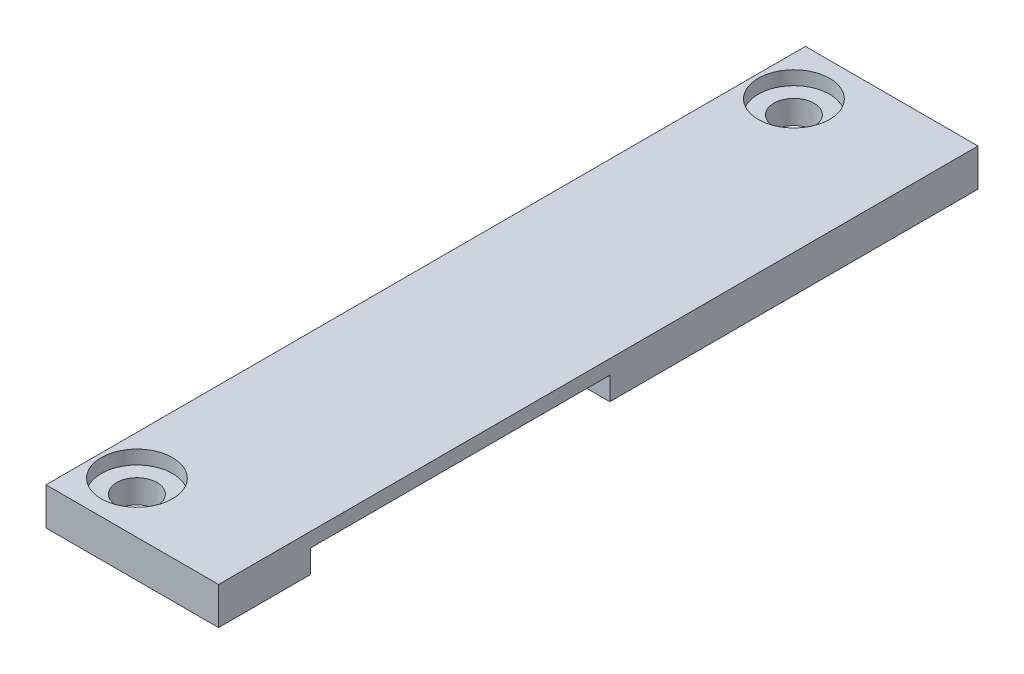
ISO-10303-21;
HEADER;
FILE_DESCRIPTION(('STEP AP214'),'2;1');
FILE_NAME('part.step','',(''),(''),'','','');
FILE_SCHEMA(('AUTOMOTIVE_DESIGN { 1 0 10303 214 1 1 1 1 }'));
ENDSEC;
DATA;
#1=APPLICATION_CONTEXT('core data for automotive mechanical design processes');
#2=APPLICATION_PROTOCOL_DEFINITION('international standard','automotive_design',2000,#1);
#3=PRODUCT_CONTEXT('',#1,'mechanical');
#4=PRODUCT('Part','Part','',(#3));
#5=PRODUCT_RELATED_PRODUCT_CATEGORY('part','',(#4));
#6=PRODUCT_DEFINITION_FORMATION('','',#4);
#7=PRODUCT_DEFINITION_CONTEXT('part definition',#1,'design');
#8=PRODUCT_DEFINITION('design','',#6,#7);
#9=PRODUCT_DEFINITION_SHAPE('','',#8);
#10=(LENGTH_UNIT() NAMED_UNIT(*) SI_UNIT(.MILLI.,.METRE.));
#11=(NAMED_UNIT(*) PLANE_ANGLE_UNIT() SI_UNIT($,.RADIAN.));
#12=(NAMED_UNIT(*) SI_UNIT($,.STERADIAN.) SOLID_ANGLE_UNIT());
#13=UNCERTAINTY_MEASURE_WITH_UNIT(LENGTH_MEASURE(1.E-05),#10,'distance_accuracy_value','');
#14=(GEOMETRIC_REPRESENTATION_CONTEXT(3) GLOBAL_UNCERTAINTY_ASSIGNED_CONTEXT((#13)) GLOBAL_UNIT_ASSIGNED_CONTEXT((#10,
#11,#12)) REPRESENTATION_CONTEXT('',''));
#15=CARTESIAN_POINT('',(0.,0.,0.));
#16=DIRECTION('',(0.,0.,1.));
#17=DIRECTION('',(1.,0.,0.));
#18=AXIS2_PLACEMENT_3D('',#15,#16,#17);
#19=CARTESIAN_POINT('',(3.45112221909818,-1.625,28.55));
#20=DIRECTION('',(0.,1.,0.));
#21=DIRECTION('',(0.,0.,1.));
#22=AXIS2_PLACEMENT_3D('',#19,#20,#21);
#23=CYLINDRICAL_SURFACE('',#22,1.75);
#24=CARTESIAN_POINT('',(3.45112221909818,-1.625,28.55));
#25=DIRECTION('',(0.,1.,0.));
#26=DIRECTION('',(0.,0.,1.));
#27=AXIS2_PLACEMENT_3D('',#24,#25,#26);
#28=CIRCLE('',#27,1.75);
#29=CARTESIAN_POINT('',(3.45112221909818,-1.625,30.3));
#30=VERTEX_POINT('',#29);
#31=EDGE_CURVE('E154',#30,#30,#28,.T.);
#32=ORIENTED_EDGE('',*,*,#31,.F.);
#33=EDGE_LOOP('',(#32));
#34=FACE_BOUND('',#33,.T.);
#35=CARTESIAN_POINT('',(3.45112221909818,0.425,28.55));
#36=DIRECTION('',(0.,1.,0.));
#37=DIRECTION('',(0.,0.,1.));
#38=AXIS2_PLACEMENT_3D('',#35,#36,#37);
#39=CIRCLE('',#38,1.75);
#40=CARTESIAN_POINT('',(3.45112221909818,0.425,30.3));
#41=VERTEX_POINT('',#40);
#42=EDGE_CURVE('E229',#41,#41,#39,.T.);
#43=ORIENTED_EDGE('',*,*,#42,.T.);
#44=EDGE_LOOP('',(#43));
#45=FACE_BOUND('',#44,.T.);
#46=ADVANCED_FACE('F47',(#34,#45),#23,.F.);
#47=CARTESIAN_POINT('',(3.45112221909818,-1.625,-28.55));
#48=DIRECTION('',(0.,1.,0.));
#49=DIRECTION('',(0.,0.,1.));
#50=AXIS2_PLACEMENT_3D('',#47,#48,#49);
#51=CYLINDRICAL_SURFACE('',#50,1.75);
#52=CARTESIAN_POINT('',(3.45112221909818,-1.625,-28.55));
#53=DIRECTION('',(0.,1.,0.));
#54=DIRECTION('',(0.,0.,1.));
#55=AXIS2_PLACEMENT_3D('',#52,#53,#54);
#56=CIRCLE('',#55,1.75);
#57=CARTESIAN_POINT('',(3.45112221909818,-1.625,-26.8));
#58=VERTEX_POINT('',#57);
#59=EDGE_CURVE('E212',#58,#58,#56,.T.);
#60=ORIENTED_EDGE('',*,*,#59,.F.);
#61=EDGE_LOOP('',(#60));
#62=FACE_BOUND('',#61,.T.);
#63=CARTESIAN_POINT('',(3.45112221909818,0.425,-28.55));
#64=DIRECTION('',(0.,1.,0.));
#65=DIRECTION('',(0.,0.,1.));
#66=AXIS2_PLACEMENT_3D('',#63,#64,#65);
#67=CIRCLE('',#66,1.75);
#68=CARTESIAN_POINT('',(3.45112221909818,0.425,-26.8));
#69=VERTEX_POINT('',#68);
#70=EDGE_CURVE('E225',#69,#69,#67,.T.);
#71=ORIENTED_EDGE('',*,*,#70,.T.);
#72=EDGE_LOOP('',(#71));
#73=FACE_BOUND('',#72,.T.);
#74=ADVANCED_FACE('F278',(#62,#73),#51,.F.);
#75=CARTESIAN_POINT('',(15.,0.,-1.));
#76=DIRECTION('',(0.,0.,1.));
#77=DIRECTION('',(1.,0.,0.));
#78=AXIS2_PLACEMENT_3D('',#75,#76,#77);
#79=PLANE('',#78);
#80=DIRECTION('',(0.,1.,0.));
#81=VECTOR('',#80,1.);
#82=CARTESIAN_POINT('',(0.,0.,-1.));
#83=LINE('',#82,#81);
#84=CARTESIAN_POINT('',(0.,-1.625,-1.));
#85=VERTEX_POINT('',#84);
#86=CARTESIAN_POINT('',(0.,0.375,-1.));
#87=VERTEX_POINT('',#86);
#88=EDGE_CURVE('E149',#85,#87,#83,.T.);
#89=ORIENTED_EDGE('',*,*,#88,.F.);
#90=DIRECTION('',(-1.,0.,0.));
#91=VECTOR('',#90,1.);
#92=CARTESIAN_POINT('',(15.,-1.625,-1.));
#93=LINE('',#92,#91);
#94=CARTESIAN_POINT('',(15.,-1.625,-1.));
#95=VERTEX_POINT('',#94);
#96=EDGE_CURVE('E11',#95,#85,#93,.T.);
#97=ORIENTED_EDGE('',*,*,#96,.F.);
#98=DIRECTION('',(0.,1.,0.));
#99=VECTOR('',#98,1.);
#100=CARTESIAN_POINT('',(15.,0.,-1.));
#101=LINE('',#100,#99);
#102=CARTESIAN_POINT('',(15.,0.375,-1.));
#103=VERTEX_POINT('',#102);
#104=EDGE_CURVE('E174',#95,#103,#101,.T.);
#105=ORIENTED_EDGE('',*,*,#104,.T.);
#106=DIRECTION('',(-1.,0.,0.));
#107=VECTOR('',#106,1.);
#108=CARTESIAN_POINT('',(15.,0.375,-1.));
#109=LINE('',#108,#107);
#110=EDGE_CURVE('E100',#103,#87,#109,.T.);
#111=ORIENTED_EDGE('',*,*,#110,.T.);
#112=EDGE_LOOP('',(#89,#97,#105,#111));
#113=FACE_BOUND('',#112,.T.);
#114=ADVANCED_FACE('F49',(#113),#79,.T.);
#115=CARTESIAN_POINT('',(15.,-1.625,0.));
#116=DIRECTION('',(0.,1.,0.));
#117=DIRECTION('',(0.,0.,1.));
#118=AXIS2_PLACEMENT_3D('',#115,#116,#117);
#119=PLANE('',#118);
#120=ORIENTED_EDGE('',*,*,#59,.T.);
#121=EDGE_LOOP('',(#120));
#122=FACE_BOUND('',#121,.T.);
#123=DIRECTION('',(0.,0.,-1.));
#124=VECTOR('',#123,1.);
#125=CARTESIAN_POINT('',(0.,-1.625,0.));
#126=LINE('',#125,#124);
#127=CARTESIAN_POINT('',(0.,-1.625,-33.));
#128=VERTEX_POINT('',#127);
#129=EDGE_CURVE('E153',#85,#128,#126,.T.);
#130=ORIENTED_EDGE('',*,*,#129,.T.);
#131=DIRECTION('',(-1.,0.,0.));
#132=VECTOR('',#131,1.);
#133=CARTESIAN_POINT('',(15.,-1.625,-33.));
#134=LINE('',#133,#132);
#135=CARTESIAN_POINT('',(15.,-1.625,-33.));
#136=VERTEX_POINT('',#135);
#137=EDGE_CURVE('E57',#136,#128,#134,.T.);
#138=ORIENTED_EDGE('',*,*,#137,.F.);
#139=DIRECTION('',(0.,0.,-1.));
#140=VECTOR('',#139,1.);
#141=CARTESIAN_POINT('',(15.,-1.625,0.));
#142=LINE('',#141,#140);
#143=EDGE_CURVE('E132',#95,#136,#142,.T.);
#144=ORIENTED_EDGE('',*,*,#143,.F.);
#145=ORIENTED_EDGE('',*,*,#96,.T.);
#146=EDGE_LOOP('',(#130,#138,#144,#145));
#147=FACE_BOUND('',#146,.T.);
#148=ADVANCED_FACE('F196',(#122,#147),#119,.F.);
#149=CARTESIAN_POINT('',(15.,0.,-33.));
#150=DIRECTION('',(0.,0.,-1.));
#151=DIRECTION('',(-1.,0.,0.));
#152=AXIS2_PLACEMENT_3D('',#149,#150,#151);
#153=PLANE('',#152);
#154=DIRECTION('',(0.,-1.,0.));
#155=VECTOR('',#154,1.);
#156=CARTESIAN_POINT('',(0.,0.,-33.));
#157=LINE('',#156,#155);
#158=CARTESIAN_POINT('',(0.,1.625,-33.));
#159=VERTEX_POINT('',#158);
#160=EDGE_CURVE('E158',#159,#128,#157,.T.);
#161=ORIENTED_EDGE('',*,*,#160,.F.);
#162=DIRECTION('',(-1.,0.,0.));
#163=VECTOR('',#162,1.);
#164=CARTESIAN_POINT('',(15.,1.625,-33.));
#165=LINE('',#164,#163);
#166=CARTESIAN_POINT('',(15.,1.625,-33.));
#167=VERTEX_POINT('',#166);
#168=EDGE_CURVE('E184',#167,#159,#165,.T.);
#169=ORIENTED_EDGE('',*,*,#168,.F.);
#170=DIRECTION('',(0.,-1.,0.));
#171=VECTOR('',#170,1.);
#172=CARTESIAN_POINT('',(15.,0.,-33.));
#173=LINE('',#172,#171);
#174=EDGE_CURVE('E193',#167,#136,#173,.T.);
#175=ORIENTED_EDGE('',*,*,#174,.T.);
#176=ORIENTED_EDGE('',*,*,#137,.T.);
#177=EDGE_LOOP('',(#161,#169,#175,#176));
#178=FACE_BOUND('',#177,.T.);
#179=ADVANCED_FACE('F191',(#178),#153,.T.);
#180=CARTESIAN_POINT('',(15.,1.625,0.));
#181=DIRECTION('',(0.,1.,0.));
#182=DIRECTION('',(0.,0.,1.));
#183=AXIS2_PLACEMENT_3D('',#180,#181,#182);
#184=PLANE('',#183);
#185=CARTESIAN_POINT('',(3.45112221909818,1.625,28.55));
#186=DIRECTION('',(0.,1.,0.));
#187=DIRECTION('',(0.,0.,1.));
#188=AXIS2_PLACEMENT_3D('',#185,#186,#187);
#189=CIRCLE('',#188,3.1);
#190=CARTESIAN_POINT('',(3.45112221909818,1.625,31.65));
#191=VERTEX_POINT('',#190);
#192=EDGE_CURVE('E233',#191,#191,#189,.T.);
#193=ORIENTED_EDGE('',*,*,#192,.F.);
#194=EDGE_LOOP('',(#193));
#195=FACE_BOUND('',#194,.T.);
#196=CARTESIAN_POINT('',(3.45112221909818,1.625,-28.55));
#197=DIRECTION('',(0.,1.,0.));
#198=DIRECTION('',(0.,0.,1.));
#199=AXIS2_PLACEMENT_3D('',#196,#197,#198);
#200=CIRCLE('',#199,3.1);
#201=CARTESIAN_POINT('',(3.45112221909818,1.625,-25.45));
#202=VERTEX_POINT('',#201);
#203=EDGE_CURVE('E220',#202,#202,#200,.T.);
#204=ORIENTED_EDGE('',*,*,#203,.F.);
#205=EDGE_LOOP('',(#204));
#206=FACE_BOUND('',#205,.T.);
#207=DIRECTION('',(0.,0.,-1.));
#208=VECTOR('',#207,1.);
#209=CARTESIAN_POINT('',(0.,1.625,0.));
#210=LINE('',#209,#208);
#211=CARTESIAN_POINT('',(0.,1.625,33.));
#212=VERTEX_POINT('',#211);
#213=EDGE_CURVE('E162',#212,#159,#210,.T.);
#214=ORIENTED_EDGE('',*,*,#213,.F.);
#215=DIRECTION('',(-1.,0.,0.));
#216=VECTOR('',#215,1.);
#217=CARTESIAN_POINT('',(15.,1.625,33.));
#218=LINE('',#217,#216);
#219=CARTESIAN_POINT('',(15.,1.625,33.));
#220=VERTEX_POINT('',#219);
#221=EDGE_CURVE('E181',#220,#212,#218,.T.);
#222=ORIENTED_EDGE('',*,*,#221,.F.);
#223=DIRECTION('',(0.,0.,-1.));
#224=VECTOR('',#223,1.);
#225=CARTESIAN_POINT('',(15.,1.625,0.));
#226=LINE('',#225,#224);
#227=EDGE_CURVE('E204',#220,#167,#226,.T.);
#228=ORIENTED_EDGE('',*,*,#227,.T.);
#229=ORIENTED_EDGE('',*,*,#168,.T.);
#230=EDGE_LOOP('',(#214,#222,#228,#229));
#231=FACE_BOUND('',#230,.T.);
#232=ADVANCED_FACE('F202',(#195,#206,#231),#184,.T.);
#233=CARTESIAN_POINT('',(15.,0.,33.));
#234=DIRECTION('',(0.,0.,-1.));
#235=DIRECTION('',(-1.,0.,0.));
#236=AXIS2_PLACEMENT_3D('',#233,#234,#235);
#237=PLANE('',#236);
#238=DIRECTION('',(0.,-1.,0.));
#239=VECTOR('',#238,1.);
#240=CARTESIAN_POINT('',(0.,0.,33.));
#241=LINE('',#240,#239);
#242=CARTESIAN_POINT('',(0.,-1.625,33.));
#243=VERTEX_POINT('',#242);
#244=EDGE_CURVE('E166',#212,#243,#241,.T.);
#245=ORIENTED_EDGE('',*,*,#244,.T.);
#246=DIRECTION('',(-1.,0.,0.));
#247=VECTOR('',#246,1.);
#248=CARTESIAN_POINT('',(15.,-1.625,33.));
#249=LINE('',#248,#247);
#250=CARTESIAN_POINT('',(15.,-1.625,33.));
#251=VERTEX_POINT('',#250);
#252=EDGE_CURVE('E138',#251,#243,#249,.T.);
#253=ORIENTED_EDGE('',*,*,#252,.F.);
#254=DIRECTION('',(0.,-1.,0.));
#255=VECTOR('',#254,1.);
#256=CARTESIAN_POINT('',(15.,0.,33.));
#257=LINE('',#256,#255);
#258=EDGE_CURVE('E126',#220,#251,#257,.T.);
#259=ORIENTED_EDGE('',*,*,#258,.F.);
#260=ORIENTED_EDGE('',*,*,#221,.T.);
#261=EDGE_LOOP('',(#245,#253,#259,#260));
#262=FACE_BOUND('',#261,.T.);
#263=ADVANCED_FACE('F260',(#262),#237,.F.);
#264=ORIENTED_EDGE('',*,*,#31,.T.);
#265=EDGE_LOOP('',(#264));
#266=FACE_BOUND('',#265,.T.);
#267=CARTESIAN_POINT('',(0.,-1.625,25.));
#268=VERTEX_POINT('',#267);
#269=EDGE_CURVE('E136',#243,#268,#126,.T.);
#270=ORIENTED_EDGE('',*,*,#269,.T.);
#271=DIRECTION('',(-1.,0.,0.));
#272=VECTOR('',#271,1.);
#273=CARTESIAN_POINT('',(15.,-1.625,25.));
#274=LINE('',#273,#272);
#275=CARTESIAN_POINT('',(15.,-1.625,25.));
#276=VERTEX_POINT('',#275);
#277=EDGE_CURVE('E133',#276,#268,#274,.T.);
#278=ORIENTED_EDGE('',*,*,#277,.F.);
#279=EDGE_CURVE('E119',#251,#276,#142,.T.);
#280=ORIENTED_EDGE('',*,*,#279,.F.);
#281=ORIENTED_EDGE('',*,*,#252,.T.);
#282=EDGE_LOOP('',(#270,#278,#280,#281));
#283=FACE_BOUND('',#282,.T.);
#284=ADVANCED_FACE('F134',(#266,#283),#119,.F.);
#285=CARTESIAN_POINT('',(15.,0.,25.));
#286=DIRECTION('',(0.,0.,1.));
#287=DIRECTION('',(1.,0.,0.));
#288=AXIS2_PLACEMENT_3D('',#285,#286,#287);
#289=PLANE('',#288);
#290=DIRECTION('',(0.,1.,0.));
#291=VECTOR('',#290,1.);
#292=CARTESIAN_POINT('',(0.,0.,25.));
#293=LINE('',#292,#291);
#294=CARTESIAN_POINT('',(0.,0.375,25.));
#295=VERTEX_POINT('',#294);
#296=EDGE_CURVE('E93',#268,#295,#293,.T.);
#297=ORIENTED_EDGE('',*,*,#296,.T.);
#298=DIRECTION('',(-1.,0.,0.));
#299=VECTOR('',#298,1.);
#300=CARTESIAN_POINT('',(15.,0.375,25.));
#301=LINE('',#300,#299);
#302=CARTESIAN_POINT('',(15.,0.375,25.));
#303=VERTEX_POINT('',#302);
#304=EDGE_CURVE('E139',#303,#295,#301,.T.);
#305=ORIENTED_EDGE('',*,*,#304,.F.);
#306=DIRECTION('',(0.,1.,0.));
#307=VECTOR('',#306,1.);
#308=CARTESIAN_POINT('',(15.,0.,25.));
#309=LINE('',#308,#307);
#310=EDGE_CURVE('E123',#276,#303,#309,.T.);
#311=ORIENTED_EDGE('',*,*,#310,.F.);
#312=ORIENTED_EDGE('',*,*,#277,.T.);
#313=EDGE_LOOP('',(#297,#305,#311,#312));
#314=FACE_BOUND('',#313,.T.);
#315=ADVANCED_FACE('F141',(#314),#289,.F.);
#316=CARTESIAN_POINT('',(15.,0.375,0.));
#317=DIRECTION('',(0.,1.,0.));
#318=DIRECTION('',(0.,0.,1.));
#319=AXIS2_PLACEMENT_3D('',#316,#317,#318);
#320=PLANE('',#319);
#321=DIRECTION('',(0.,0.,-1.));
#322=VECTOR('',#321,1.);
#323=CARTESIAN_POINT('',(0.,0.375,0.));
#324=LINE('',#323,#322);
#325=EDGE_CURVE('E171',#295,#87,#324,.T.);
#326=ORIENTED_EDGE('',*,*,#325,.T.);
#327=ORIENTED_EDGE('',*,*,#110,.F.);
#328=DIRECTION('',(0.,0.,-1.));
#329=VECTOR('',#328,1.);
#330=CARTESIAN_POINT('',(15.,0.375,0.));
#331=LINE('',#330,#329);
#332=EDGE_CURVE('E65',#303,#103,#331,.T.);
#333=ORIENTED_EDGE('',*,*,#332,.F.);
#334=ORIENTED_EDGE('',*,*,#304,.T.);
#335=EDGE_LOOP('',(#326,#327,#333,#334));
#336=FACE_BOUND('',#335,.T.);
#337=ADVANCED_FACE('F289',(#336),#320,.F.);
#338=CARTESIAN_POINT('',(15.,0.,0.));
#339=DIRECTION('',(1.,0.,0.));
#340=DIRECTION('',(0.,0.,-1.));
#341=AXIS2_PLACEMENT_3D('',#338,#339,#340);
#342=PLANE('',#341);
#343=ORIENTED_EDGE('',*,*,#104,.F.);
#344=ORIENTED_EDGE('',*,*,#143,.T.);
#345=ORIENTED_EDGE('',*,*,#174,.F.);
#346=ORIENTED_EDGE('',*,*,#227,.F.);
#347=ORIENTED_EDGE('',*,*,#258,.T.);
#348=ORIENTED_EDGE('',*,*,#279,.T.);
#349=ORIENTED_EDGE('',*,*,#310,.T.);
#350=ORIENTED_EDGE('',*,*,#332,.T.);
#351=EDGE_LOOP('',(#343,#344,#345,#346,#347,#348,#349,#350));
#352=FACE_BOUND('',#351,.T.);
#353=ADVANCED_FACE('F121',(#352),#342,.T.);
#354=CARTESIAN_POINT('',(0.,0.,0.));
#355=DIRECTION('',(1.,0.,0.));
#356=DIRECTION('',(0.,0.,-1.));
#357=AXIS2_PLACEMENT_3D('',#354,#355,#356);
#358=PLANE('',#357);
#359=ORIENTED_EDGE('',*,*,#88,.T.);
#360=ORIENTED_EDGE('',*,*,#325,.F.);
#361=ORIENTED_EDGE('',*,*,#296,.F.);
#362=ORIENTED_EDGE('',*,*,#269,.F.);
#363=ORIENTED_EDGE('',*,*,#244,.F.);
#364=ORIENTED_EDGE('',*,*,#213,.T.);
#365=ORIENTED_EDGE('',*,*,#160,.T.);
#366=ORIENTED_EDGE('',*,*,#129,.F.);
#367=EDGE_LOOP('',(#359,#360,#361,#362,#363,#364,#365,#366));
#368=FACE_BOUND('',#367,.T.);
#369=ADVANCED_FACE('F198',(#368),#358,.F.);
#370=CARTESIAN_POINT('',(3.45112221909818,0.425,-28.55));
#371=DIRECTION('',(0.,1.,0.));
#372=DIRECTION('',(0.,0.,1.));
#373=AXIS2_PLACEMENT_3D('',#370,#371,#372);
#374=CYLINDRICAL_SURFACE('',#373,3.1);
#375=CARTESIAN_POINT('',(3.45112221909818,0.425,-28.55));
#376=DIRECTION('',(0.,1.,0.));
#377=DIRECTION('',(0.,0.,1.));
#378=AXIS2_PLACEMENT_3D('',#375,#376,#377);
#379=CIRCLE('',#378,3.1);
#380=CARTESIAN_POINT('',(3.45112221909818,0.425,-25.45));
#381=VERTEX_POINT('',#380);
#382=EDGE_CURVE('E224',#381,#381,#379,.T.);
#383=ORIENTED_EDGE('',*,*,#382,.F.);
#384=EDGE_LOOP('',(#383));
#385=FACE_BOUND('',#384,.T.);
#386=ORIENTED_EDGE('',*,*,#203,.T.);
#387=EDGE_LOOP('',(#386));
#388=FACE_BOUND('',#387,.T.);
#389=ADVANCED_FACE('F264',(#385,#388),#374,.F.);
#390=CARTESIAN_POINT('',(3.45112221909818,0.425,-28.55));
#391=DIRECTION('',(0.,1.,0.));
#392=DIRECTION('',(0.,0.,1.));
#393=AXIS2_PLACEMENT_3D('',#390,#391,#392);
#394=PLANE('',#393);
#395=ORIENTED_EDGE('',*,*,#70,.F.);
#396=EDGE_LOOP('',(#395));
#397=FACE_BOUND('',#396,.T.);
#398=ORIENTED_EDGE('',*,*,#382,.T.);
#399=EDGE_LOOP('',(#398));
#400=FACE_BOUND('',#399,.T.);
#401=ADVANCED_FACE('F254',(#397,#400),#394,.T.);
#402=CARTESIAN_POINT('',(3.45112221909818,0.425,28.55));
#403=DIRECTION('',(0.,1.,0.));
#404=DIRECTION('',(0.,0.,1.));
#405=AXIS2_PLACEMENT_3D('',#402,#403,#404);
#406=CYLINDRICAL_SURFACE('',#405,3.1);
#407=CARTESIAN_POINT('',(3.45112221909818,0.425,28.55));
#408=DIRECTION('',(0.,1.,0.));
#409=DIRECTION('',(0.,0.,1.));
#410=AXIS2_PLACEMENT_3D('',#407,#408,#409);
#411=CIRCLE('',#410,3.1);
#412=CARTESIAN_POINT('',(3.45112221909818,0.425,31.65));
#413=VERTEX_POINT('',#412);
#414=EDGE_CURVE('E216',#413,#413,#411,.T.);
#415=ORIENTED_EDGE('',*,*,#414,.F.);
#416=EDGE_LOOP('',(#415));
#417=FACE_BOUND('',#416,.T.);
#418=ORIENTED_EDGE('',*,*,#192,.T.);
#419=EDGE_LOOP('',(#418));
#420=FACE_BOUND('',#419,.T.);
#421=ADVANCED_FACE('F248',(#417,#420),#406,.F.);
#422=CARTESIAN_POINT('',(3.45112221909818,0.425,28.55));
#423=DIRECTION('',(0.,1.,0.));
#424=DIRECTION('',(0.,0.,1.));
#425=AXIS2_PLACEMENT_3D('',#422,#423,#424);
#426=PLANE('',#425);
#427=ORIENTED_EDGE('',*,*,#42,.F.);
#428=EDGE_LOOP('',(#427));
#429=FACE_BOUND('',#428,.T.);
#430=ORIENTED_EDGE('',*,*,#414,.T.);
#431=EDGE_LOOP('',(#430));
#432=FACE_BOUND('',#431,.T.);
#433=ADVANCED_FACE('F245',(#429,#432),#426,.T.);
#434=CLOSED_SHELL('',(#46,#74,#114,#148,#179,#232,#263,#284,#315,#337,#353,#369,#389,#401,#421,#433));
#435=MANIFOLD_SOLID_BREP('B2',#434);
#436=ADVANCED_BREP_SHAPE_REPRESENTATION('',(#18,#435),#14);
#437=SHAPE_DEFINITION_REPRESENTATION(#9,#436);
ENDSEC;
END-ISO-10303-21;
